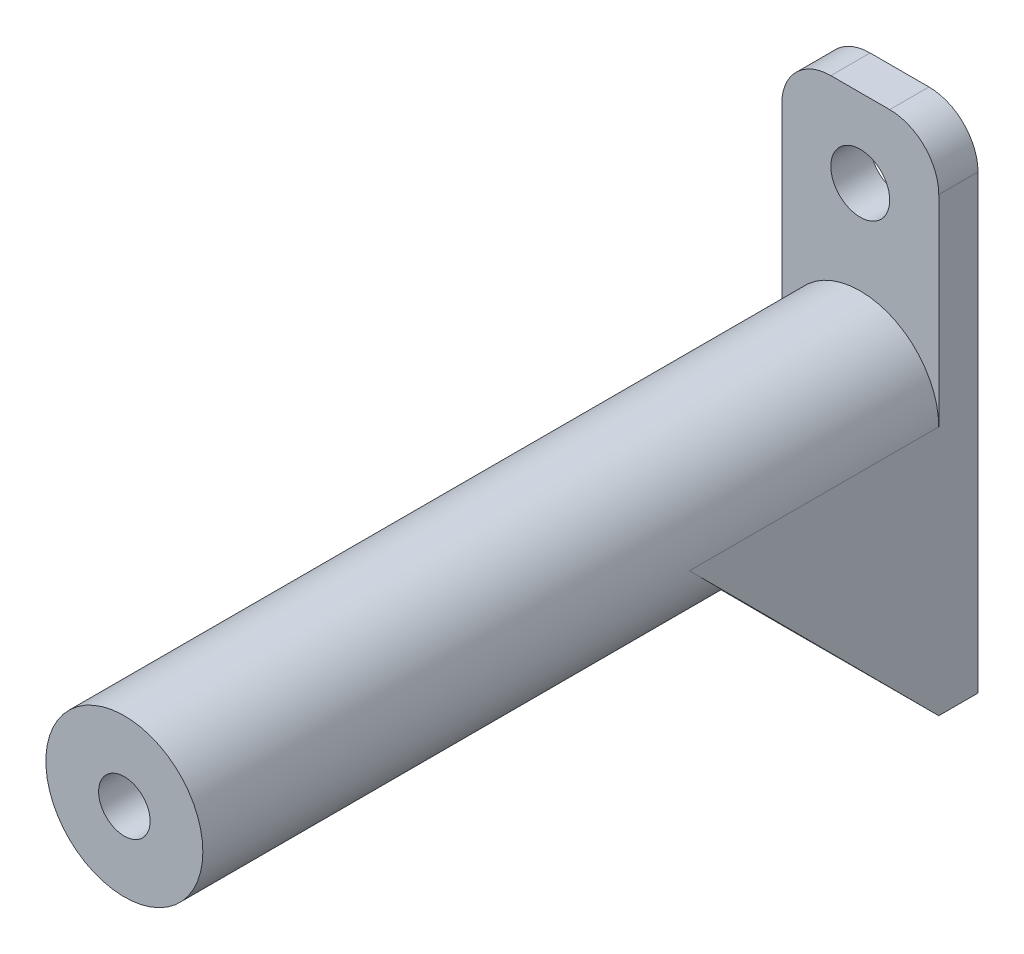
ISO-10303-21;
HEADER;
FILE_DESCRIPTION(('STEP AP214'),'2;1');
FILE_NAME('part.step','',(''),(''),'','','');
FILE_SCHEMA(('AUTOMOTIVE_DESIGN { 1 0 10303 214 1 1 1 1 }'));
ENDSEC;
DATA;
#1=APPLICATION_CONTEXT('core data for automotive mechanical design processes');
#2=APPLICATION_PROTOCOL_DEFINITION('international standard','automotive_design',2000,#1);
#3=PRODUCT_CONTEXT('',#1,'mechanical');
#4=PRODUCT('Part','Part','',(#3));
#5=PRODUCT_RELATED_PRODUCT_CATEGORY('part','',(#4));
#6=PRODUCT_DEFINITION_FORMATION('','',#4);
#7=PRODUCT_DEFINITION_CONTEXT('part definition',#1,'design');
#8=PRODUCT_DEFINITION('design','',#6,#7);
#9=PRODUCT_DEFINITION_SHAPE('','',#8);
#10=(LENGTH_UNIT() NAMED_UNIT(*) SI_UNIT(.MILLI.,.METRE.));
#11=(NAMED_UNIT(*) PLANE_ANGLE_UNIT() SI_UNIT($,.RADIAN.));
#12=(NAMED_UNIT(*) SI_UNIT($,.STERADIAN.) SOLID_ANGLE_UNIT());
#13=UNCERTAINTY_MEASURE_WITH_UNIT(LENGTH_MEASURE(1.E-05),#10,'distance_accuracy_value','');
#14=(GEOMETRIC_REPRESENTATION_CONTEXT(3) GLOBAL_UNCERTAINTY_ASSIGNED_CONTEXT((#13)) GLOBAL_UNIT_ASSIGNED_CONTEXT((#10,
#11,#12)) REPRESENTATION_CONTEXT('',''));
#15=CARTESIAN_POINT('',(0.,0.,0.));
#16=DIRECTION('',(0.,0.,1.));
#17=DIRECTION('',(1.,0.,0.));
#18=AXIS2_PLACEMENT_3D('',#15,#16,#17);
#19=CARTESIAN_POINT('',(0.,0.,4.));
#20=DIRECTION('',(0.,0.,1.));
#21=DIRECTION('',(1.,0.,0.));
#22=AXIS2_PLACEMENT_3D('',#19,#20,#21);
#23=PLANE('',#22);
#24=DIRECTION('',(0.,1.,0.));
#25=VECTOR('',#24,1.);
#26=CARTESIAN_POINT('',(8.,-25.5,4.));
#27=LINE('',#26,#25);
#28=CARTESIAN_POINT('',(8.,0.,4.));
#29=VERTEX_POINT('',#28);
#30=CARTESIAN_POINT('',(8.,20.5,4.));
#31=VERTEX_POINT('',#30);
#32=EDGE_CURVE('E180',#29,#31,#27,.T.);
#33=ORIENTED_EDGE('',*,*,#32,.T.);
#34=CARTESIAN_POINT('',(3.,20.5,4.));
#35=DIRECTION('',(0.,0.,1.));
#36=DIRECTION('',(1.,0.,0.));
#37=AXIS2_PLACEMENT_3D('',#34,#35,#36);
#38=CIRCLE('',#37,5.);
#39=CARTESIAN_POINT('',(3.,25.5,4.));
#40=VERTEX_POINT('',#39);
#41=EDGE_CURVE('E41',#31,#40,#38,.T.);
#42=ORIENTED_EDGE('',*,*,#41,.T.);
#43=DIRECTION('',(-1.,0.,0.));
#44=VECTOR('',#43,1.);
#45=CARTESIAN_POINT('',(8.,25.5,4.));
#46=LINE('',#45,#44);
#47=CARTESIAN_POINT('',(-2.99999999999999,25.5,4.));
#48=VERTEX_POINT('',#47);
#49=EDGE_CURVE('E125',#40,#48,#46,.T.);
#50=ORIENTED_EDGE('',*,*,#49,.T.);
#51=CARTESIAN_POINT('',(-2.99999999999999,20.5,4.));
#52=DIRECTION('',(0.,0.,1.));
#53=DIRECTION('',(1.,0.,0.));
#54=AXIS2_PLACEMENT_3D('',#51,#52,#53);
#55=CIRCLE('',#54,5.);
#56=CARTESIAN_POINT('',(-7.99999999999999,20.5,4.));
#57=VERTEX_POINT('',#56);
#58=EDGE_CURVE('E48',#48,#57,#55,.T.);
#59=ORIENTED_EDGE('',*,*,#58,.T.);
#60=DIRECTION('',(0.,-1.,0.));
#61=VECTOR('',#60,1.);
#62=CARTESIAN_POINT('',(-7.99999999999999,25.5,4.));
#63=LINE('',#62,#61);
#64=CARTESIAN_POINT('',(-8.,0.,4.));
#65=VERTEX_POINT('',#64);
#66=EDGE_CURVE('E117',#57,#65,#63,.T.);
#67=ORIENTED_EDGE('',*,*,#66,.T.);
#68=CARTESIAN_POINT('',(0.,0.,4.));
#69=DIRECTION('',(0.,0.,1.));
#70=DIRECTION('',(1.,0.,0.));
#71=AXIS2_PLACEMENT_3D('',#68,#69,#70);
#72=CIRCLE('',#71,8.);
#73=EDGE_CURVE('E120',#29,#65,#72,.T.);
#74=ORIENTED_EDGE('',*,*,#73,.F.);
#75=EDGE_LOOP('',(#33,#42,#50,#59,#67,#74));
#76=FACE_BOUND('',#75,.T.);
#77=CARTESIAN_POINT('',(0.,17.5,4.));
#78=DIRECTION('',(0.,0.,1.));
#79=DIRECTION('',(1.,0.,0.));
#80=AXIS2_PLACEMENT_3D('',#77,#78,#79);
#81=CIRCLE('',#80,3.);
#82=CARTESIAN_POINT('',(3.00000000000001,17.5,4.));
#83=VERTEX_POINT('',#82);
#84=EDGE_CURVE('E171',#83,#83,#81,.T.);
#85=ORIENTED_EDGE('',*,*,#84,.F.);
#86=EDGE_LOOP('',(#85));
#87=FACE_BOUND('',#86,.T.);
#88=ADVANCED_FACE('F33',(#76,#87),#23,.T.);
#89=DIRECTION('',(0.,1.,0.));
#90=VECTOR('',#89,1.);
#91=CARTESIAN_POINT('',(-6.,-25.5,4.));
#92=LINE('',#91,#90);
#93=CARTESIAN_POINT('',(-6.,-25.5,4.));
#94=VERTEX_POINT('',#93);
#95=CARTESIAN_POINT('',(-6.,-5.29150262212918,4.));
#96=VERTEX_POINT('',#95);
#97=EDGE_CURVE('E145',#94,#96,#92,.T.);
#98=ORIENTED_EDGE('',*,*,#97,.F.);
#99=DIRECTION('',(1.,0.,0.));
#100=VECTOR('',#99,1.);
#101=CARTESIAN_POINT('',(-7.99999999999999,-25.5,4.));
#102=LINE('',#101,#100);
#103=CARTESIAN_POINT('',(6.,-25.5,4.));
#104=VERTEX_POINT('',#103);
#105=EDGE_CURVE('E181',#94,#104,#102,.T.);
#106=ORIENTED_EDGE('',*,*,#105,.T.);
#107=DIRECTION('',(0.,1.,0.));
#108=VECTOR('',#107,1.);
#109=CARTESIAN_POINT('',(6.,-25.5,4.));
#110=LINE('',#109,#108);
#111=CARTESIAN_POINT('',(6.,-5.29150262212918,4.));
#112=VERTEX_POINT('',#111);
#113=EDGE_CURVE('E154',#104,#112,#110,.T.);
#114=ORIENTED_EDGE('',*,*,#113,.T.);
#115=EDGE_CURVE('E137',#96,#112,#72,.T.);
#116=ORIENTED_EDGE('',*,*,#115,.F.);
#117=EDGE_LOOP('',(#98,#106,#114,#116));
#118=FACE_BOUND('',#117,.T.);
#119=CARTESIAN_POINT('',(0.,-17.5,4.));
#120=DIRECTION('',(0.,0.,1.));
#121=DIRECTION('',(1.,0.,0.));
#122=AXIS2_PLACEMENT_3D('',#119,#120,#121);
#123=CIRCLE('',#122,3.);
#124=CARTESIAN_POINT('',(3.00000000000001,-17.5,4.));
#125=VERTEX_POINT('',#124);
#126=EDGE_CURVE('E165',#125,#125,#123,.T.);
#127=ORIENTED_EDGE('',*,*,#126,.F.);
#128=EDGE_LOOP('',(#127));
#129=FACE_BOUND('',#128,.T.);
#130=ADVANCED_FACE('F244',(#118,#129),#23,.T.);
#131=CARTESIAN_POINT('',(0.,0.,0.));
#132=DIRECTION('',(0.,0.,1.));
#133=DIRECTION('',(1.,0.,0.));
#134=AXIS2_PLACEMENT_3D('',#131,#132,#133);
#135=PLANE('',#134);
#136=DIRECTION('',(-1.,0.,0.));
#137=VECTOR('',#136,1.);
#138=CARTESIAN_POINT('',(8.,25.5,0.));
#139=LINE('',#138,#137);
#140=CARTESIAN_POINT('',(3.,25.5,0.));
#141=VERTEX_POINT('',#140);
#142=CARTESIAN_POINT('',(-2.99999999999999,25.5,0.));
#143=VERTEX_POINT('',#142);
#144=EDGE_CURVE('E188',#141,#143,#139,.T.);
#145=ORIENTED_EDGE('',*,*,#144,.F.);
#146=CARTESIAN_POINT('',(3.,20.5,0.));
#147=DIRECTION('',(0.,0.,1.));
#148=DIRECTION('',(1.,0.,0.));
#149=AXIS2_PLACEMENT_3D('',#146,#147,#148);
#150=CIRCLE('',#149,5.);
#151=CARTESIAN_POINT('',(8.,20.5,0.));
#152=VERTEX_POINT('',#151);
#153=EDGE_CURVE('E214',#141,#152,#150,.F.);
#154=ORIENTED_EDGE('',*,*,#153,.T.);
#155=DIRECTION('',(0.,1.,0.));
#156=VECTOR('',#155,1.);
#157=CARTESIAN_POINT('',(8.,-25.5,0.));
#158=LINE('',#157,#156);
#159=CARTESIAN_POINT('',(8.,-25.5,0.));
#160=VERTEX_POINT('',#159);
#161=EDGE_CURVE('E186',#160,#152,#158,.T.);
#162=ORIENTED_EDGE('',*,*,#161,.F.);
#163=DIRECTION('',(1.,0.,0.));
#164=VECTOR('',#163,1.);
#165=CARTESIAN_POINT('',(-7.99999999999999,-25.5,0.));
#166=LINE('',#165,#164);
#167=CARTESIAN_POINT('',(-7.99999999999999,-25.5,0.));
#168=VERTEX_POINT('',#167);
#169=EDGE_CURVE('E174',#168,#160,#166,.T.);
#170=ORIENTED_EDGE('',*,*,#169,.F.);
#171=DIRECTION('',(0.,-1.,0.));
#172=VECTOR('',#171,1.);
#173=CARTESIAN_POINT('',(-7.99999999999999,25.5,0.));
#174=LINE('',#173,#172);
#175=CARTESIAN_POINT('',(-7.99999999999999,20.5,0.));
#176=VERTEX_POINT('',#175);
#177=EDGE_CURVE('E191',#176,#168,#174,.T.);
#178=ORIENTED_EDGE('',*,*,#177,.F.);
#179=CARTESIAN_POINT('',(-2.99999999999999,20.5,0.));
#180=DIRECTION('',(0.,0.,1.));
#181=DIRECTION('',(1.,0.,0.));
#182=AXIS2_PLACEMENT_3D('',#179,#180,#181);
#183=CIRCLE('',#182,5.);
#184=EDGE_CURVE('E212',#176,#143,#183,.F.);
#185=ORIENTED_EDGE('',*,*,#184,.T.);
#186=EDGE_LOOP('',(#145,#154,#162,#170,#178,#185));
#187=FACE_BOUND('',#186,.T.);
#188=CARTESIAN_POINT('',(0.,17.5,0.));
#189=DIRECTION('',(0.,0.,1.));
#190=DIRECTION('',(1.,0.,0.));
#191=AXIS2_PLACEMENT_3D('',#188,#189,#190);
#192=CIRCLE('',#191,3.);
#193=CARTESIAN_POINT('',(3.00000000000001,17.5,0.));
#194=VERTEX_POINT('',#193);
#195=EDGE_CURVE('E168',#194,#194,#192,.T.);
#196=ORIENTED_EDGE('',*,*,#195,.T.);
#197=EDGE_LOOP('',(#196));
#198=FACE_BOUND('',#197,.T.);
#199=CARTESIAN_POINT('',(0.,-17.5,0.));
#200=DIRECTION('',(0.,0.,1.));
#201=DIRECTION('',(1.,0.,0.));
#202=AXIS2_PLACEMENT_3D('',#199,#200,#201);
#203=CIRCLE('',#202,3.);
#204=CARTESIAN_POINT('',(3.00000000000001,-17.5,0.));
#205=VERTEX_POINT('',#204);
#206=EDGE_CURVE('E163',#205,#205,#203,.T.);
#207=ORIENTED_EDGE('',*,*,#206,.T.);
#208=EDGE_LOOP('',(#207));
#209=FACE_BOUND('',#208,.T.);
#210=ADVANCED_FACE('F227',(#187,#198,#209),#135,.F.);
#211=CARTESIAN_POINT('',(-7.99999999999999,-25.5,4.));
#212=DIRECTION('',(0.,1.,0.));
#213=DIRECTION('',(-1.,0.,0.));
#214=AXIS2_PLACEMENT_3D('',#211,#212,#213);
#215=PLANE('',#214);
#216=ORIENTED_EDGE('',*,*,#169,.T.);
#217=DIRECTION('',(0.,0.,-1.));
#218=VECTOR('',#217,1.);
#219=CARTESIAN_POINT('',(8.,-25.5,4.));
#220=LINE('',#219,#218);
#221=CARTESIAN_POINT('',(8.,-25.5,4.));
#222=VERTEX_POINT('',#221);
#223=EDGE_CURVE('E195',#222,#160,#220,.T.);
#224=ORIENTED_EDGE('',*,*,#223,.F.);
#225=DIRECTION('',(1.,0.,0.));
#226=VECTOR('',#225,1.);
#227=CARTESIAN_POINT('',(6.,-25.5,4.));
#228=LINE('',#227,#226);
#229=EDGE_CURVE('E135',#104,#222,#228,.T.);
#230=ORIENTED_EDGE('',*,*,#229,.F.);
#231=ORIENTED_EDGE('',*,*,#105,.F.);
#232=CARTESIAN_POINT('',(-7.99999999999999,-25.5,4.));
#233=VERTEX_POINT('',#232);
#234=EDGE_CURVE('E177',#233,#94,#102,.T.);
#235=ORIENTED_EDGE('',*,*,#234,.F.);
#236=DIRECTION('',(0.,0.,-1.));
#237=VECTOR('',#236,1.);
#238=CARTESIAN_POINT('',(-7.99999999999999,-25.5,4.));
#239=LINE('',#238,#237);
#240=EDGE_CURVE('E124',#233,#168,#239,.T.);
#241=ORIENTED_EDGE('',*,*,#240,.T.);
#242=EDGE_LOOP('',(#216,#224,#230,#231,#235,#241));
#243=FACE_BOUND('',#242,.T.);
#244=ADVANCED_FACE('F234',(#243),#215,.F.);
#245=CARTESIAN_POINT('',(8.,-25.5,4.));
#246=DIRECTION('',(-1.,0.,0.));
#247=DIRECTION('',(0.,0.,1.));
#248=AXIS2_PLACEMENT_3D('',#245,#246,#247);
#249=PLANE('',#248);
#250=ORIENTED_EDGE('',*,*,#161,.T.);
#251=DIRECTION('',(0.,0.,-1.));
#252=VECTOR('',#251,1.);
#253=CARTESIAN_POINT('',(8.,20.5,4.));
#254=LINE('',#253,#252);
#255=EDGE_CURVE('E56',#152,#31,#254,.F.);
#256=ORIENTED_EDGE('',*,*,#255,.T.);
#257=ORIENTED_EDGE('',*,*,#32,.F.);
#258=DIRECTION('',(0.,0.,1.));
#259=VECTOR('',#258,1.);
#260=CARTESIAN_POINT('',(8.,0.,4.));
#261=LINE('',#260,#259);
#262=CARTESIAN_POINT('',(8.,0.,29.4));
#263=VERTEX_POINT('',#262);
#264=EDGE_CURVE('E133',#29,#263,#261,.T.);
#265=ORIENTED_EDGE('',*,*,#264,.T.);
#266=DIRECTION('',(0.,-0.708494621686835,-0.70571621140571));
#267=VECTOR('',#266,1.);
#268=CARTESIAN_POINT('',(8.,0.,29.4));
#269=LINE('',#268,#267);
#270=EDGE_CURVE('E157',#263,#222,#269,.T.);
#271=ORIENTED_EDGE('',*,*,#270,.T.);
#272=ORIENTED_EDGE('',*,*,#223,.T.);
#273=EDGE_LOOP('',(#250,#256,#257,#265,#271,#272));
#274=FACE_BOUND('',#273,.T.);
#275=ADVANCED_FACE('F230',(#274),#249,.F.);
#276=CARTESIAN_POINT('',(8.,25.5,4.));
#277=DIRECTION('',(0.,-1.,0.));
#278=DIRECTION('',(1.,0.,0.));
#279=AXIS2_PLACEMENT_3D('',#276,#277,#278);
#280=PLANE('',#279);
#281=ORIENTED_EDGE('',*,*,#49,.F.);
#282=DIRECTION('',(0.,0.,-1.));
#283=VECTOR('',#282,1.);
#284=CARTESIAN_POINT('',(3.,25.5,4.));
#285=LINE('',#284,#283);
#286=EDGE_CURVE('E209',#40,#141,#285,.T.);
#287=ORIENTED_EDGE('',*,*,#286,.T.);
#288=ORIENTED_EDGE('',*,*,#144,.T.);
#289=DIRECTION('',(0.,0.,-1.));
#290=VECTOR('',#289,1.);
#291=CARTESIAN_POINT('',(-2.99999999999999,25.5,4.));
#292=LINE('',#291,#290);
#293=EDGE_CURVE('E207',#143,#48,#292,.F.);
#294=ORIENTED_EDGE('',*,*,#293,.T.);
#295=EDGE_LOOP('',(#281,#287,#288,#294));
#296=FACE_BOUND('',#295,.T.);
#297=ADVANCED_FACE('F222',(#296),#280,.F.);
#298=CARTESIAN_POINT('',(-7.99999999999999,25.5,4.));
#299=DIRECTION('',(1.,0.,0.));
#300=DIRECTION('',(0.,0.,-1.));
#301=AXIS2_PLACEMENT_3D('',#298,#299,#300);
#302=PLANE('',#301);
#303=ORIENTED_EDGE('',*,*,#66,.F.);
#304=DIRECTION('',(0.,0.,-1.));
#305=VECTOR('',#304,1.);
#306=CARTESIAN_POINT('',(-7.99999999999999,20.5,4.));
#307=LINE('',#306,#305);
#308=EDGE_CURVE('E11',#57,#176,#307,.T.);
#309=ORIENTED_EDGE('',*,*,#308,.T.);
#310=ORIENTED_EDGE('',*,*,#177,.T.);
#311=ORIENTED_EDGE('',*,*,#240,.F.);
#312=DIRECTION('',(0.,-0.708494621686835,-0.70571621140571));
#313=VECTOR('',#312,1.);
#314=CARTESIAN_POINT('',(-8.,0.,29.4));
#315=LINE('',#314,#313);
#316=CARTESIAN_POINT('',(-8.,0.,29.4));
#317=VERTEX_POINT('',#316);
#318=EDGE_CURVE('E141',#317,#233,#315,.T.);
#319=ORIENTED_EDGE('',*,*,#318,.F.);
#320=DIRECTION('',(0.,0.,1.));
#321=VECTOR('',#320,1.);
#322=CARTESIAN_POINT('',(-8.,0.,4.));
#323=LINE('',#322,#321);
#324=EDGE_CURVE('E129',#65,#317,#323,.T.);
#325=ORIENTED_EDGE('',*,*,#324,.F.);
#326=EDGE_LOOP('',(#303,#309,#310,#311,#319,#325));
#327=FACE_BOUND('',#326,.T.);
#328=ADVANCED_FACE('F139',(#327),#302,.F.);
#329=CARTESIAN_POINT('',(0.,17.5,4.));
#330=DIRECTION('',(0.,0.,-1.));
#331=DIRECTION('',(-1.,0.,0.));
#332=AXIS2_PLACEMENT_3D('',#329,#330,#331);
#333=CYLINDRICAL_SURFACE('',#332,3.);
#334=ORIENTED_EDGE('',*,*,#84,.T.);
#335=EDGE_LOOP('',(#334));
#336=FACE_BOUND('',#335,.T.);
#337=ORIENTED_EDGE('',*,*,#195,.F.);
#338=EDGE_LOOP('',(#337));
#339=FACE_BOUND('',#338,.T.);
#340=ADVANCED_FACE('F252',(#336,#339),#333,.F.);
#341=CARTESIAN_POINT('',(0.,-17.5,4.));
#342=DIRECTION('',(0.,0.,-1.));
#343=DIRECTION('',(-1.,0.,0.));
#344=AXIS2_PLACEMENT_3D('',#341,#342,#343);
#345=CYLINDRICAL_SURFACE('',#344,3.);
#346=ORIENTED_EDGE('',*,*,#126,.T.);
#347=EDGE_LOOP('',(#346));
#348=FACE_BOUND('',#347,.T.);
#349=ORIENTED_EDGE('',*,*,#206,.F.);
#350=EDGE_LOOP('',(#349));
#351=FACE_BOUND('',#350,.T.);
#352=ADVANCED_FACE('F288',(#348,#351),#345,.F.);
#353=CARTESIAN_POINT('',(0.,0.,79.));
#354=DIRECTION('',(0.,0.,-1.));
#355=DIRECTION('',(-1.,0.,0.));
#356=AXIS2_PLACEMENT_3D('',#353,#354,#355);
#357=CYLINDRICAL_SURFACE('',#356,8.);
#358=CARTESIAN_POINT('',(0.,0.,79.));
#359=DIRECTION('',(0.,0.,1.));
#360=DIRECTION('',(1.,0.,0.));
#361=AXIS2_PLACEMENT_3D('',#358,#359,#360);
#362=CIRCLE('',#361,8.);
#363=CARTESIAN_POINT('',(8.,0.,79.));
#364=VERTEX_POINT('',#363);
#365=EDGE_CURVE('E134',#364,#364,#362,.T.);
#366=ORIENTED_EDGE('',*,*,#365,.F.);
#367=EDGE_LOOP('',(#366));
#368=FACE_BOUND('',#367,.T.);
#369=CARTESIAN_POINT('',(0.,0.,29.4));
#370=DIRECTION('',(0.,0.70571621140571,-0.708494621686835));
#371=DIRECTION('',(0.,-0.708494621686835,-0.70571621140571));
#372=AXIS2_PLACEMENT_3D('',#369,#370,#371);
#373=ELLIPSE('',#372,11.2915465483041,8.);
#374=CARTESIAN_POINT('',(-6.,-5.29150262212918,24.1292483685458));
#375=VERTEX_POINT('',#374);
#376=EDGE_CURVE('E203',#375,#317,#373,.T.);
#377=ORIENTED_EDGE('',*,*,#376,.F.);
#378=DIRECTION('',(0.,0.,-1.));
#379=VECTOR('',#378,1.);
#380=CARTESIAN_POINT('',(-6.,-5.29150262212918,79.));
#381=LINE('',#380,#379);
#382=EDGE_CURVE('E205',#375,#96,#381,.T.);
#383=ORIENTED_EDGE('',*,*,#382,.T.);
#384=ORIENTED_EDGE('',*,*,#115,.T.);
#385=DIRECTION('',(0.,0.,-1.));
#386=VECTOR('',#385,1.);
#387=CARTESIAN_POINT('',(6.,-5.29150262212918,79.));
#388=LINE('',#387,#386);
#389=CARTESIAN_POINT('',(6.,-5.29150262212918,24.1292483685458));
#390=VERTEX_POINT('',#389);
#391=EDGE_CURVE('E200',#112,#390,#388,.F.);
#392=ORIENTED_EDGE('',*,*,#391,.T.);
#393=CARTESIAN_POINT('',(0.,0.,29.4));
#394=DIRECTION('',(0.,-0.70571621140571,0.708494621686835));
#395=DIRECTION('',(0.,-0.708494621686835,-0.70571621140571));
#396=AXIS2_PLACEMENT_3D('',#393,#394,#395);
#397=ELLIPSE('',#396,11.2915465483041,8.);
#398=EDGE_CURVE('E198',#390,#263,#397,.T.);
#399=ORIENTED_EDGE('',*,*,#398,.T.);
#400=ORIENTED_EDGE('',*,*,#264,.F.);
#401=ORIENTED_EDGE('',*,*,#73,.T.);
#402=ORIENTED_EDGE('',*,*,#324,.T.);
#403=EDGE_LOOP('',(#377,#383,#384,#392,#399,#400,#401,#402));
#404=FACE_BOUND('',#403,.T.);
#405=ADVANCED_FACE('F128',(#368,#404),#357,.T.);
#406=CARTESIAN_POINT('',(0.,0.,79.));
#407=DIRECTION('',(0.,0.,1.));
#408=DIRECTION('',(1.,0.,0.));
#409=AXIS2_PLACEMENT_3D('',#406,#407,#408);
#410=PLANE('',#409);
#411=CARTESIAN_POINT('',(0.,0.,79.));
#412=DIRECTION('',(0.,0.,1.));
#413=DIRECTION('',(1.,0.,0.));
#414=AXIS2_PLACEMENT_3D('',#411,#412,#413);
#415=CIRCLE('',#414,2.625);
#416=CARTESIAN_POINT('',(2.625,0.,79.));
#417=VERTEX_POINT('',#416);
#418=EDGE_CURVE('E416',#417,#417,#415,.T.);
#419=ORIENTED_EDGE('',*,*,#418,.F.);
#420=EDGE_LOOP('',(#419));
#421=FACE_BOUND('',#420,.T.);
#422=ORIENTED_EDGE('',*,*,#365,.T.);
#423=EDGE_LOOP('',(#422));
#424=FACE_BOUND('',#423,.T.);
#425=ADVANCED_FACE('F301',(#421,#424),#410,.T.);
#426=CARTESIAN_POINT('',(6.,0.,0.));
#427=DIRECTION('',(-1.,0.,0.));
#428=DIRECTION('',(0.,0.,1.));
#429=AXIS2_PLACEMENT_3D('',#426,#427,#428);
#430=PLANE('',#429);
#431=ORIENTED_EDGE('',*,*,#391,.F.);
#432=ORIENTED_EDGE('',*,*,#113,.F.);
#433=DIRECTION('',(0.,-0.708494621686835,-0.70571621140571));
#434=VECTOR('',#433,1.);
#435=CARTESIAN_POINT('',(6.,0.,29.4));
#436=LINE('',#435,#434);
#437=EDGE_CURVE('E151',#390,#104,#436,.T.);
#438=ORIENTED_EDGE('',*,*,#437,.F.);
#439=EDGE_LOOP('',(#431,#432,#438));
#440=FACE_BOUND('',#439,.T.);
#441=ADVANCED_FACE('F310',(#440),#430,.T.);
#442=CARTESIAN_POINT('',(6.,0.,29.4));
#443=DIRECTION('',(0.,-0.70571621140571,0.708494621686835));
#444=DIRECTION('',(0.,-0.708494621686835,-0.70571621140571));
#445=AXIS2_PLACEMENT_3D('',#442,#443,#444);
#446=PLANE('',#445);
#447=ORIENTED_EDGE('',*,*,#398,.F.);
#448=ORIENTED_EDGE('',*,*,#437,.T.);
#449=ORIENTED_EDGE('',*,*,#229,.T.);
#450=ORIENTED_EDGE('',*,*,#270,.F.);
#451=EDGE_LOOP('',(#447,#448,#449,#450));
#452=FACE_BOUND('',#451,.T.);
#453=ADVANCED_FACE('F319',(#452),#446,.T.);
#454=CARTESIAN_POINT('',(-6.,0.,0.));
#455=DIRECTION('',(1.,0.,0.));
#456=DIRECTION('',(0.,0.,1.));
#457=AXIS2_PLACEMENT_3D('',#454,#455,#456);
#458=PLANE('',#457);
#459=ORIENTED_EDGE('',*,*,#382,.F.);
#460=DIRECTION('',(0.,-0.708494621686835,-0.70571621140571));
#461=VECTOR('',#460,1.);
#462=CARTESIAN_POINT('',(-6.,0.,29.4));
#463=LINE('',#462,#461);
#464=EDGE_CURVE('E142',#375,#94,#463,.T.);
#465=ORIENTED_EDGE('',*,*,#464,.T.);
#466=ORIENTED_EDGE('',*,*,#97,.T.);
#467=EDGE_LOOP('',(#459,#465,#466));
#468=FACE_BOUND('',#467,.T.);
#469=ADVANCED_FACE('F327',(#468),#458,.T.);
#470=CARTESIAN_POINT('',(-6.,0.,29.4));
#471=DIRECTION('',(0.,0.70571621140571,-0.708494621686835));
#472=DIRECTION('',(0.,0.708494621686835,0.70571621140571));
#473=AXIS2_PLACEMENT_3D('',#470,#471,#472);
#474=PLANE('',#473);
#475=ORIENTED_EDGE('',*,*,#464,.F.);
#476=ORIENTED_EDGE('',*,*,#376,.T.);
#477=ORIENTED_EDGE('',*,*,#318,.T.);
#478=ORIENTED_EDGE('',*,*,#234,.T.);
#479=EDGE_LOOP('',(#475,#476,#477,#478));
#480=FACE_BOUND('',#479,.T.);
#481=ADVANCED_FACE('F334',(#480),#474,.F.);
#482=CARTESIAN_POINT('',(0.,0.,44.));
#483=DIRECTION('',(0.,0.,1.));
#484=DIRECTION('',(1.,0.,0.));
#485=AXIS2_PLACEMENT_3D('',#482,#483,#484);
#486=CYLINDRICAL_SURFACE('',#485,2.625);
#487=CARTESIAN_POINT('',(0.,0.,44.));
#488=DIRECTION('',(0.,0.,1.));
#489=DIRECTION('',(1.,0.,0.));
#490=AXIS2_PLACEMENT_3D('',#487,#488,#489);
#491=CIRCLE('',#490,2.625);
#492=CARTESIAN_POINT('',(2.625,0.,44.));
#493=VERTEX_POINT('',#492);
#494=EDGE_CURVE('E147',#493,#493,#491,.T.);
#495=ORIENTED_EDGE('',*,*,#494,.F.);
#496=EDGE_LOOP('',(#495));
#497=FACE_BOUND('',#496,.T.);
#498=ORIENTED_EDGE('',*,*,#418,.T.);
#499=EDGE_LOOP('',(#498));
#500=FACE_BOUND('',#499,.T.);
#501=ADVANCED_FACE('F341',(#497,#500),#486,.F.);
#502=CARTESIAN_POINT('',(0.,0.,44.));
#503=DIRECTION('',(0.,0.,1.));
#504=DIRECTION('',(1.,0.,0.));
#505=AXIS2_PLACEMENT_3D('',#502,#503,#504);
#506=PLANE('',#505);
#507=ORIENTED_EDGE('',*,*,#494,.T.);
#508=EDGE_LOOP('',(#507));
#509=FACE_BOUND('',#508,.T.);
#510=ADVANCED_FACE('F242',(#509),#506,.T.);
#511=CARTESIAN_POINT('',(3.,20.5,4.));
#512=DIRECTION('',(0.,0.,-1.));
#513=DIRECTION('',(-1.,0.,0.));
#514=AXIS2_PLACEMENT_3D('',#511,#512,#513);
#515=CYLINDRICAL_SURFACE('',#514,5.);
#516=ORIENTED_EDGE('',*,*,#41,.F.);
#517=ORIENTED_EDGE('',*,*,#255,.F.);
#518=ORIENTED_EDGE('',*,*,#153,.F.);
#519=ORIENTED_EDGE('',*,*,#286,.F.);
#520=EDGE_LOOP('',(#516,#517,#518,#519));
#521=FACE_BOUND('',#520,.T.);
#522=ADVANCED_FACE('F225',(#521),#515,.T.);
#523=CARTESIAN_POINT('',(-2.99999999999999,20.5,4.));
#524=DIRECTION('',(0.,0.,-1.));
#525=DIRECTION('',(-1.,0.,0.));
#526=AXIS2_PLACEMENT_3D('',#523,#524,#525);
#527=CYLINDRICAL_SURFACE('',#526,5.);
#528=ORIENTED_EDGE('',*,*,#58,.F.);
#529=ORIENTED_EDGE('',*,*,#293,.F.);
#530=ORIENTED_EDGE('',*,*,#184,.F.);
#531=ORIENTED_EDGE('',*,*,#308,.F.);
#532=EDGE_LOOP('',(#528,#529,#530,#531));
#533=FACE_BOUND('',#532,.T.);
#534=ADVANCED_FACE('F35',(#533),#527,.T.);
#535=CLOSED_SHELL('',(#88,#130,#210,#244,#275,#297,#328,#340,#352,#405,#425,#441,#453,#469,#481,
#501,#510,#522,#534));
#536=MANIFOLD_SOLID_BREP('B2',#535);
#537=ADVANCED_BREP_SHAPE_REPRESENTATION('',(#18,#536),#14);
#538=SHAPE_DEFINITION_REPRESENTATION(#9,#537);
ENDSEC;
END-ISO-10303-21;
